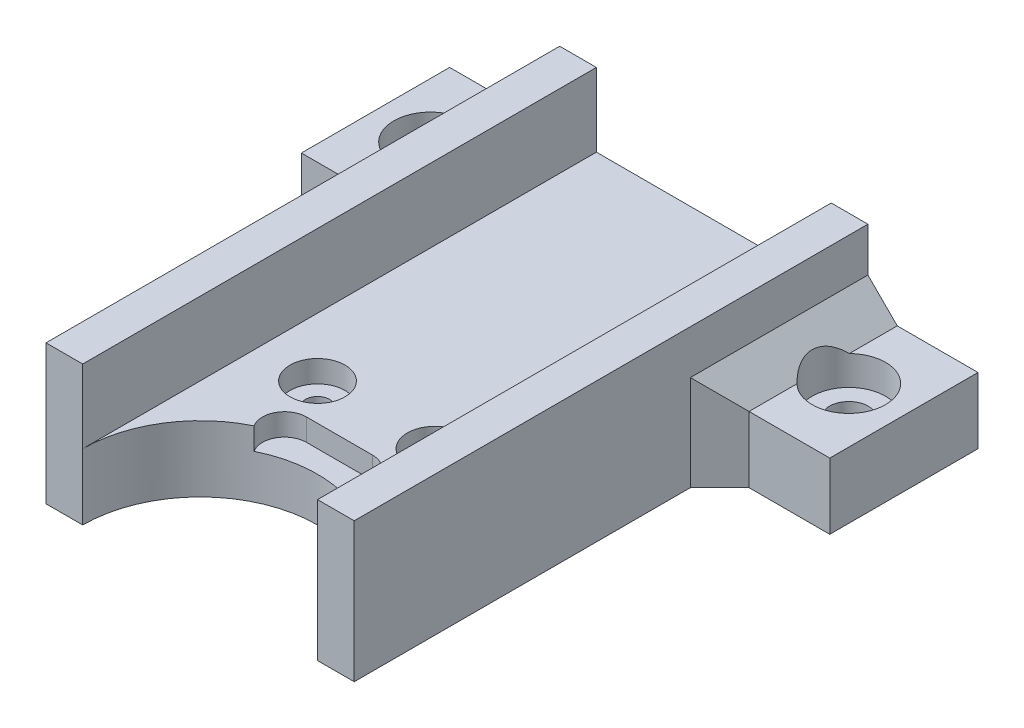
ISO-10303-21;
HEADER;
FILE_DESCRIPTION(('STEP AP214'),'2;1');
FILE_NAME('part.step','',(''),(''),'','','');
FILE_SCHEMA(('AUTOMOTIVE_DESIGN { 1 0 10303 214 1 1 1 1 }'));
ENDSEC;
DATA;
#1=APPLICATION_CONTEXT('core data for automotive mechanical design processes');
#2=APPLICATION_PROTOCOL_DEFINITION('international standard','automotive_design',2000,#1);
#3=PRODUCT_CONTEXT('',#1,'mechanical');
#4=PRODUCT('Part','Part','',(#3));
#5=PRODUCT_RELATED_PRODUCT_CATEGORY('part','',(#4));
#6=PRODUCT_DEFINITION_FORMATION('','',#4);
#7=PRODUCT_DEFINITION_CONTEXT('part definition',#1,'design');
#8=PRODUCT_DEFINITION('design','',#6,#7);
#9=PRODUCT_DEFINITION_SHAPE('','',#8);
#10=(LENGTH_UNIT() NAMED_UNIT(*) SI_UNIT(.MILLI.,.METRE.));
#11=(NAMED_UNIT(*) PLANE_ANGLE_UNIT() SI_UNIT($,.RADIAN.));
#12=(NAMED_UNIT(*) SI_UNIT($,.STERADIAN.) SOLID_ANGLE_UNIT());
#13=UNCERTAINTY_MEASURE_WITH_UNIT(LENGTH_MEASURE(1.E-05),#10,'distance_accuracy_value','');
#14=(GEOMETRIC_REPRESENTATION_CONTEXT(3) GLOBAL_UNCERTAINTY_ASSIGNED_CONTEXT((#13)) GLOBAL_UNIT_ASSIGNED_CONTEXT((#10,
#11,#12)) REPRESENTATION_CONTEXT('',''));
#15=CARTESIAN_POINT('',(0.,0.,0.));
#16=DIRECTION('',(0.,0.,1.));
#17=DIRECTION('',(1.,0.,0.));
#18=AXIS2_PLACEMENT_3D('',#15,#16,#17);
#19=CARTESIAN_POINT('',(-7.5,9.,-59.9000000000001));
#20=DIRECTION('',(0.,-1.,0.));
#21=DIRECTION('',(0.,0.,-1.));
#22=AXIS2_PLACEMENT_3D('',#19,#20,#21);
#23=CYLINDRICAL_SURFACE('',#22,2.64999999999999);
#24=CARTESIAN_POINT('',(-7.5,0.,-59.9000000000001));
#25=DIRECTION('',(0.,1.,0.));
#26=DIRECTION('',(0.,0.,1.));
#27=AXIS2_PLACEMENT_3D('',#24,#25,#26);
#28=CIRCLE('',#27,2.64999999999999);
#29=CARTESIAN_POINT('',(-7.5,0.,-57.2500000000001));
#30=VERTEX_POINT('',#29);
#31=EDGE_CURVE('E381',#30,#30,#28,.T.);
#32=ORIENTED_EDGE('',*,*,#31,.F.);
#33=EDGE_LOOP('',(#32));
#34=FACE_BOUND('',#33,.T.);
#35=CARTESIAN_POINT('',(-7.5,5.,-59.9000000000001));
#36=DIRECTION('',(0.,1.,0.));
#37=DIRECTION('',(0.,0.,1.));
#38=AXIS2_PLACEMENT_3D('',#35,#36,#37);
#39=CIRCLE('',#38,2.64999999999999);
#40=CARTESIAN_POINT('',(-7.5,5.,-57.2500000000001));
#41=VERTEX_POINT('',#40);
#42=EDGE_CURVE('E48',#41,#41,#39,.T.);
#43=ORIENTED_EDGE('',*,*,#42,.T.);
#44=EDGE_LOOP('',(#43));
#45=FACE_BOUND('',#44,.T.);
#46=ADVANCED_FACE('F43',(#34,#45),#23,.F.);
#47=CARTESIAN_POINT('',(49.5,9.,-59.9000000000001));
#48=DIRECTION('',(0.,-1.,0.));
#49=DIRECTION('',(0.,0.,-1.));
#50=AXIS2_PLACEMENT_3D('',#47,#48,#49);
#51=CYLINDRICAL_SURFACE('',#50,2.65);
#52=CARTESIAN_POINT('',(49.5,0.,-59.9000000000001));
#53=DIRECTION('',(0.,1.,0.));
#54=DIRECTION('',(0.,0.,1.));
#55=AXIS2_PLACEMENT_3D('',#52,#53,#54);
#56=CIRCLE('',#55,2.65);
#57=CARTESIAN_POINT('',(49.5,0.,-57.2500000000001));
#58=VERTEX_POINT('',#57);
#59=EDGE_CURVE('E377',#58,#58,#56,.T.);
#60=ORIENTED_EDGE('',*,*,#59,.F.);
#61=EDGE_LOOP('',(#60));
#62=FACE_BOUND('',#61,.T.);
#63=CARTESIAN_POINT('',(49.5,5.,-59.9000000000001));
#64=DIRECTION('',(0.,1.,0.));
#65=DIRECTION('',(0.,0.,1.));
#66=AXIS2_PLACEMENT_3D('',#63,#64,#65);
#67=CIRCLE('',#66,2.65);
#68=CARTESIAN_POINT('',(49.5,5.,-57.2500000000001));
#69=VERTEX_POINT('',#68);
#70=EDGE_CURVE('E252',#69,#69,#67,.T.);
#71=ORIENTED_EDGE('',*,*,#70,.T.);
#72=EDGE_LOOP('',(#71));
#73=FACE_BOUND('',#72,.T.);
#74=ADVANCED_FACE('F597',(#62,#73),#51,.F.);
#75=CARTESIAN_POINT('',(29.,10.,-24.));
#76=DIRECTION('',(0.,-1.,0.));
#77=DIRECTION('',(0.,0.,-1.));
#78=AXIS2_PLACEMENT_3D('',#75,#76,#77);
#79=CYLINDRICAL_SURFACE('',#78,1.65);
#80=CARTESIAN_POINT('',(29.,0.,-24.));
#81=DIRECTION('',(0.,-1.,0.));
#82=DIRECTION('',(0.,0.,-1.));
#83=AXIS2_PLACEMENT_3D('',#80,#81,#82);
#84=CIRCLE('',#83,1.65);
#85=CARTESIAN_POINT('',(29.,0.,-25.65));
#86=VERTEX_POINT('',#85);
#87=EDGE_CURVE('E314',#86,#86,#84,.T.);
#88=ORIENTED_EDGE('',*,*,#87,.T.);
#89=EDGE_LOOP('',(#88));
#90=FACE_BOUND('',#89,.T.);
#91=CARTESIAN_POINT('',(29.,6.,-24.));
#92=DIRECTION('',(0.,1.,0.));
#93=DIRECTION('',(0.,0.,1.));
#94=AXIS2_PLACEMENT_3D('',#91,#92,#93);
#95=CIRCLE('',#94,1.65);
#96=CARTESIAN_POINT('',(29.,6.,-22.35));
#97=VERTEX_POINT('',#96);
#98=EDGE_CURVE('E318',#97,#97,#95,.F.);
#99=ORIENTED_EDGE('',*,*,#98,.F.);
#100=EDGE_LOOP('',(#99));
#101=FACE_BOUND('',#100,.T.);
#102=ADVANCED_FACE('F603',(#90,#101),#79,.F.);
#103=CARTESIAN_POINT('',(13.,10.,-24.));
#104=DIRECTION('',(0.,-1.,0.));
#105=DIRECTION('',(0.,0.,-1.));
#106=AXIS2_PLACEMENT_3D('',#103,#104,#105);
#107=CYLINDRICAL_SURFACE('',#106,1.65);
#108=CARTESIAN_POINT('',(13.,0.,-24.));
#109=DIRECTION('',(0.,-1.,0.));
#110=DIRECTION('',(0.,0.,-1.));
#111=AXIS2_PLACEMENT_3D('',#108,#109,#110);
#112=CIRCLE('',#111,1.65);
#113=CARTESIAN_POINT('',(13.,0.,-25.65));
#114=VERTEX_POINT('',#113);
#115=EDGE_CURVE('E309',#114,#114,#112,.T.);
#116=ORIENTED_EDGE('',*,*,#115,.T.);
#117=EDGE_LOOP('',(#116));
#118=FACE_BOUND('',#117,.T.);
#119=CARTESIAN_POINT('',(13.,6.,-24.));
#120=DIRECTION('',(0.,1.,0.));
#121=DIRECTION('',(0.,0.,1.));
#122=AXIS2_PLACEMENT_3D('',#119,#120,#121);
#123=CIRCLE('',#122,1.65);
#124=CARTESIAN_POINT('',(13.,6.,-22.35));
#125=VERTEX_POINT('',#124);
#126=EDGE_CURVE('E297',#125,#125,#123,.F.);
#127=ORIENTED_EDGE('',*,*,#126,.F.);
#128=EDGE_LOOP('',(#127));
#129=FACE_BOUND('',#128,.T.);
#130=ADVANCED_FACE('F613',(#118,#129),#107,.F.);
#131=CARTESIAN_POINT('',(21.,9.,0.));
#132=DIRECTION('',(0.,1.,0.));
#133=DIRECTION('',(0.,0.,1.));
#134=AXIS2_PLACEMENT_3D('',#131,#132,#133);
#135=PLANE('',#134);
#136=DIRECTION('',(0.,0.,1.));
#137=VECTOR('',#136,1.);
#138=CARTESIAN_POINT('',(46.,9.,0.));
#139=LINE('',#138,#137);
#140=CARTESIAN_POINT('',(46.,9.,-70.));
#141=VERTEX_POINT('',#140);
#142=CARTESIAN_POINT('',(46.,9.,-63.4707142142715));
#143=VERTEX_POINT('',#142);
#144=EDGE_CURVE('E501',#141,#143,#139,.T.);
#145=ORIENTED_EDGE('',*,*,#144,.T.);
#146=CARTESIAN_POINT('',(49.5,9.,-59.9000000000001));
#147=DIRECTION('',(0.,1.,0.));
#148=DIRECTION('',(0.,0.,1.));
#149=AXIS2_PLACEMENT_3D('',#146,#147,#148);
#150=CIRCLE('',#149,5.00000000000001);
#151=CARTESIAN_POINT('',(46.,9.,-56.3292857857286));
#152=VERTEX_POINT('',#151);
#153=EDGE_CURVE('E60',#143,#152,#150,.F.);
#154=ORIENTED_EDGE('',*,*,#153,.T.);
#155=CARTESIAN_POINT('',(46.,9.,-49.8000000000001));
#156=VERTEX_POINT('',#155);
#157=EDGE_CURVE('E500',#152,#156,#139,.T.);
#158=ORIENTED_EDGE('',*,*,#157,.T.);
#159=DIRECTION('',(1.,0.,0.));
#160=VECTOR('',#159,1.);
#161=CARTESIAN_POINT('',(57.,9.,-49.8000000000001));
#162=LINE('',#161,#160);
#163=CARTESIAN_POINT('',(57.,9.,-49.8000000000001));
#164=VERTEX_POINT('',#163);
#165=EDGE_CURVE('E403',#156,#164,#162,.T.);
#166=ORIENTED_EDGE('',*,*,#165,.T.);
#167=DIRECTION('',(0.,0.,-1.));
#168=VECTOR('',#167,1.);
#169=CARTESIAN_POINT('',(57.,9.,-70.));
#170=LINE('',#169,#168);
#171=CARTESIAN_POINT('',(57.,9.,-70.));
#172=VERTEX_POINT('',#171);
#173=EDGE_CURVE('E406',#164,#172,#170,.T.);
#174=ORIENTED_EDGE('',*,*,#173,.T.);
#175=DIRECTION('',(-1.,0.,0.));
#176=VECTOR('',#175,1.);
#177=CARTESIAN_POINT('',(0.,9.,-70.));
#178=LINE('',#177,#176);
#179=EDGE_CURVE('E386',#172,#141,#178,.T.);
#180=ORIENTED_EDGE('',*,*,#179,.T.);
#181=EDGE_LOOP('',(#145,#154,#158,#166,#174,#180));
#182=FACE_BOUND('',#181,.T.);
#183=ADVANCED_FACE('F566',(#182),#135,.T.);
#184=CARTESIAN_POINT('',(16.5,9.,-16.));
#185=DIRECTION('',(0.,1.,0.));
#186=DIRECTION('',(0.,0.,1.));
#187=AXIS2_PLACEMENT_3D('',#184,#185,#186);
#188=CIRCLE('',#187,3.);
#189=CARTESIAN_POINT('',(16.5,9.,-19.));
#190=VERTEX_POINT('',#189);
#191=CARTESIAN_POINT('',(13.9773001549495,9.,-14.3764281685795));
#192=VERTEX_POINT('',#191);
#193=EDGE_CURVE('E248',#190,#192,#188,.T.);
#194=ORIENTED_EDGE('',*,*,#193,.F.);
#195=DIRECTION('',(-1.,0.,0.));
#196=VECTOR('',#195,1.);
#197=CARTESIAN_POINT('',(16.5,9.,-19.));
#198=LINE('',#197,#196);
#199=CARTESIAN_POINT('',(25.5,9.,-19.));
#200=VERTEX_POINT('',#199);
#201=EDGE_CURVE('E270',#200,#190,#198,.T.);
#202=ORIENTED_EDGE('',*,*,#201,.F.);
#203=CARTESIAN_POINT('',(25.5,9.,-16.));
#204=DIRECTION('',(0.,1.,0.));
#205=DIRECTION('',(0.,0.,1.));
#206=AXIS2_PLACEMENT_3D('',#203,#204,#205);
#207=CIRCLE('',#206,3.);
#208=CARTESIAN_POINT('',(28.0226998450505,9.,-14.3764281685795));
#209=VERTEX_POINT('',#208);
#210=EDGE_CURVE('E280',#209,#200,#207,.T.);
#211=ORIENTED_EDGE('',*,*,#210,.F.);
#212=CARTESIAN_POINT('',(21.,9.,0.));
#213=DIRECTION('',(0.,-1.,0.));
#214=DIRECTION('',(0.,0.,1.));
#215=AXIS2_PLACEMENT_3D('',#212,#213,#214);
#216=CIRCLE('',#215,16.);
#217=CARTESIAN_POINT('',(37.,9.,0.));
#218=VERTEX_POINT('',#217);
#219=EDGE_CURVE('E398',#209,#218,#216,.T.);
#220=ORIENTED_EDGE('',*,*,#219,.T.);
#221=DIRECTION('',(0.,0.,1.));
#222=VECTOR('',#221,1.);
#223=CARTESIAN_POINT('',(37.,9.,0.));
#224=LINE('',#223,#222);
#225=CARTESIAN_POINT('',(37.,9.,-70.));
#226=VERTEX_POINT('',#225);
#227=EDGE_CURVE('E313',#226,#218,#224,.T.);
#228=ORIENTED_EDGE('',*,*,#227,.F.);
#229=CARTESIAN_POINT('',(5.,9.,-70.));
#230=VERTEX_POINT('',#229);
#231=EDGE_CURVE('E391',#226,#230,#178,.T.);
#232=ORIENTED_EDGE('',*,*,#231,.T.);
#233=DIRECTION('',(0.,0.,-1.));
#234=VECTOR('',#233,1.);
#235=CARTESIAN_POINT('',(5.,9.,0.));
#236=LINE('',#235,#234);
#237=CARTESIAN_POINT('',(4.99999999999999,9.,0.));
#238=VERTEX_POINT('',#237);
#239=EDGE_CURVE('E348',#238,#230,#236,.T.);
#240=ORIENTED_EDGE('',*,*,#239,.F.);
#241=EDGE_CURVE('E399',#238,#192,#216,.T.);
#242=ORIENTED_EDGE('',*,*,#241,.T.);
#243=EDGE_LOOP('',(#194,#202,#211,#220,#228,#232,#240,#242));
#244=FACE_BOUND('',#243,.T.);
#245=CARTESIAN_POINT('',(13.,9.,-24.));
#246=DIRECTION('',(0.,1.,0.));
#247=DIRECTION('',(0.,0.,1.));
#248=AXIS2_PLACEMENT_3D('',#245,#246,#247);
#249=CIRCLE('',#248,3.75);
#250=CARTESIAN_POINT('',(13.,9.,-20.25));
#251=VERTEX_POINT('',#250);
#252=EDGE_CURVE('E298',#251,#251,#249,.T.);
#253=ORIENTED_EDGE('',*,*,#252,.F.);
#254=EDGE_LOOP('',(#253));
#255=FACE_BOUND('',#254,.T.);
#256=CARTESIAN_POINT('',(29.,9.,-24.));
#257=DIRECTION('',(0.,1.,0.));
#258=DIRECTION('',(0.,0.,1.));
#259=AXIS2_PLACEMENT_3D('',#256,#257,#258);
#260=CIRCLE('',#259,3.75);
#261=CARTESIAN_POINT('',(29.,9.,-20.25));
#262=VERTEX_POINT('',#261);
#263=EDGE_CURVE('E289',#262,#262,#260,.T.);
#264=ORIENTED_EDGE('',*,*,#263,.F.);
#265=EDGE_LOOP('',(#264));
#266=FACE_BOUND('',#265,.T.);
#267=ADVANCED_FACE('F612',(#244,#255,#266),#135,.T.);
#268=DIRECTION('',(0.,0.,-1.));
#269=VECTOR('',#268,1.);
#270=CARTESIAN_POINT('',(-3.99999999999999,9.,0.));
#271=LINE('',#270,#269);
#272=CARTESIAN_POINT('',(-3.99999999999999,9.,-49.8000000000001));
#273=VERTEX_POINT('',#272);
#274=CARTESIAN_POINT('',(-3.99999999999999,9.,-56.3292857857286));
#275=VERTEX_POINT('',#274);
#276=EDGE_CURVE('E218',#273,#275,#271,.T.);
#277=ORIENTED_EDGE('',*,*,#276,.T.);
#278=CARTESIAN_POINT('',(-7.5,9.,-59.9000000000001));
#279=DIRECTION('',(0.,1.,0.));
#280=DIRECTION('',(0.,0.,1.));
#281=AXIS2_PLACEMENT_3D('',#278,#279,#280);
#282=CIRCLE('',#281,5.00000000000001);
#283=CARTESIAN_POINT('',(-3.99999999999999,9.,-63.4707142142715));
#284=VERTEX_POINT('',#283);
#285=EDGE_CURVE('E67',#275,#284,#282,.F.);
#286=ORIENTED_EDGE('',*,*,#285,.T.);
#287=CARTESIAN_POINT('',(-3.99999999999999,9.,-70.));
#288=VERTEX_POINT('',#287);
#289=EDGE_CURVE('E215',#284,#288,#271,.T.);
#290=ORIENTED_EDGE('',*,*,#289,.T.);
#291=CARTESIAN_POINT('',(-15.,9.,-70.));
#292=VERTEX_POINT('',#291);
#293=EDGE_CURVE('E392',#288,#292,#178,.T.);
#294=ORIENTED_EDGE('',*,*,#293,.T.);
#295=DIRECTION('',(0.,0.,1.));
#296=VECTOR('',#295,1.);
#297=CARTESIAN_POINT('',(-15.,9.,-70.));
#298=LINE('',#297,#296);
#299=CARTESIAN_POINT('',(-15.,9.,-49.8000000000001));
#300=VERTEX_POINT('',#299);
#301=EDGE_CURVE('E390',#292,#300,#298,.T.);
#302=ORIENTED_EDGE('',*,*,#301,.T.);
#303=DIRECTION('',(1.,0.,0.));
#304=VECTOR('',#303,1.);
#305=CARTESIAN_POINT('',(0.,9.,-49.8000000000001));
#306=LINE('',#305,#304);
#307=EDGE_CURVE('E395',#300,#273,#306,.T.);
#308=ORIENTED_EDGE('',*,*,#307,.T.);
#309=EDGE_LOOP('',(#277,#286,#290,#294,#302,#308));
#310=FACE_BOUND('',#309,.T.);
#311=ADVANCED_FACE('F214',(#310),#135,.T.);
#312=CARTESIAN_POINT('',(21.,0.,0.));
#313=DIRECTION('',(0.,1.,0.));
#314=DIRECTION('',(0.,0.,1.));
#315=AXIS2_PLACEMENT_3D('',#312,#313,#314);
#316=PLANE('',#315);
#317=ORIENTED_EDGE('',*,*,#115,.F.);
#318=EDGE_LOOP('',(#317));
#319=FACE_BOUND('',#318,.T.);
#320=ORIENTED_EDGE('',*,*,#87,.F.);
#321=EDGE_LOOP('',(#320));
#322=FACE_BOUND('',#321,.T.);
#323=DIRECTION('',(-1.,0.,0.));
#324=VECTOR('',#323,1.);
#325=CARTESIAN_POINT('',(0.,0.,-70.));
#326=LINE('',#325,#324);
#327=CARTESIAN_POINT('',(57.,0.,-70.));
#328=VERTEX_POINT('',#327);
#329=CARTESIAN_POINT('',(-15.,0.,-70.));
#330=VERTEX_POINT('',#329);
#331=EDGE_CURVE('E385',#328,#330,#326,.T.);
#332=ORIENTED_EDGE('',*,*,#331,.F.);
#333=DIRECTION('',(0.,0.,-1.));
#334=VECTOR('',#333,1.);
#335=CARTESIAN_POINT('',(57.,0.,-70.));
#336=LINE('',#335,#334);
#337=CARTESIAN_POINT('',(57.,0.,-49.8000000000001));
#338=VERTEX_POINT('',#337);
#339=EDGE_CURVE('E438',#338,#328,#336,.T.);
#340=ORIENTED_EDGE('',*,*,#339,.F.);
#341=DIRECTION('',(1.,0.,0.));
#342=VECTOR('',#341,1.);
#343=CARTESIAN_POINT('',(57.,0.,-49.8000000000001));
#344=LINE('',#343,#342);
#345=CARTESIAN_POINT('',(46.,0.,-49.8000000000001));
#346=VERTEX_POINT('',#345);
#347=EDGE_CURVE('E435',#346,#338,#344,.T.);
#348=ORIENTED_EDGE('',*,*,#347,.F.);
#349=DIRECTION('',(0.707106781186544,0.,-0.707106781186551));
#350=VECTOR('',#349,1.);
#351=CARTESIAN_POINT('',(8.60000000000006,0.,-12.3999999999998));
#352=LINE('',#351,#350);
#353=CARTESIAN_POINT('',(42.,0.,-45.8000000000001));
#354=VERTEX_POINT('',#353);
#355=EDGE_CURVE('E229',#346,#354,#352,.F.);
#356=ORIENTED_EDGE('',*,*,#355,.T.);
#357=DIRECTION('',(0.,0.,-1.));
#358=VECTOR('',#357,1.);
#359=CARTESIAN_POINT('',(42.,0.,-49.8000000000001));
#360=LINE('',#359,#358);
#361=CARTESIAN_POINT('',(42.,0.,0.));
#362=VERTEX_POINT('',#361);
#363=EDGE_CURVE('E431',#362,#354,#360,.T.);
#364=ORIENTED_EDGE('',*,*,#363,.F.);
#365=DIRECTION('',(1.,0.,0.));
#366=VECTOR('',#365,1.);
#367=CARTESIAN_POINT('',(42.,0.,0.));
#368=LINE('',#367,#366);
#369=CARTESIAN_POINT('',(37.,0.,0.));
#370=VERTEX_POINT('',#369);
#371=EDGE_CURVE('E428',#370,#362,#368,.T.);
#372=ORIENTED_EDGE('',*,*,#371,.F.);
#373=CARTESIAN_POINT('',(21.,0.,0.));
#374=DIRECTION('',(0.,-1.,0.));
#375=DIRECTION('',(0.,0.,1.));
#376=AXIS2_PLACEMENT_3D('',#373,#374,#375);
#377=CIRCLE('',#376,16.);
#378=CARTESIAN_POINT('',(4.99999999999999,0.,0.));
#379=VERTEX_POINT('',#378);
#380=EDGE_CURVE('E425',#379,#370,#377,.T.);
#381=ORIENTED_EDGE('',*,*,#380,.F.);
#382=DIRECTION('',(1.,0.,0.));
#383=VECTOR('',#382,1.);
#384=CARTESIAN_POINT('',(4.99999999999999,0.,0.));
#385=LINE('',#384,#383);
#386=CARTESIAN_POINT('',(0.,0.,0.));
#387=VERTEX_POINT('',#386);
#388=EDGE_CURVE('E422',#387,#379,#385,.T.);
#389=ORIENTED_EDGE('',*,*,#388,.F.);
#390=DIRECTION('',(0.,0.,1.));
#391=VECTOR('',#390,1.);
#392=CARTESIAN_POINT('',(0.,0.,0.));
#393=LINE('',#392,#391);
#394=CARTESIAN_POINT('',(0.,0.,-45.8000000000001));
#395=VERTEX_POINT('',#394);
#396=EDGE_CURVE('E419',#395,#387,#393,.T.);
#397=ORIENTED_EDGE('',*,*,#396,.F.);
#398=DIRECTION('',(0.707106781186544,0.,0.707106781186551));
#399=VECTOR('',#398,1.);
#400=CARTESIAN_POINT('',(33.3999999999999,0.,-12.3999999999998));
#401=LINE('',#400,#399);
#402=CARTESIAN_POINT('',(-3.99999999999999,0.,-49.8000000000001));
#403=VERTEX_POINT('',#402);
#404=EDGE_CURVE('E239',#395,#403,#401,.F.);
#405=ORIENTED_EDGE('',*,*,#404,.T.);
#406=DIRECTION('',(1.,0.,0.));
#407=VECTOR('',#406,1.);
#408=CARTESIAN_POINT('',(0.,0.,-49.8000000000001));
#409=LINE('',#408,#407);
#410=CARTESIAN_POINT('',(-15.,0.,-49.8000000000001));
#411=VERTEX_POINT('',#410);
#412=EDGE_CURVE('E415',#411,#403,#409,.T.);
#413=ORIENTED_EDGE('',*,*,#412,.F.);
#414=DIRECTION('',(0.,0.,1.));
#415=VECTOR('',#414,1.);
#416=CARTESIAN_POINT('',(-15.,0.,-70.));
#417=LINE('',#416,#415);
#418=EDGE_CURVE('E412',#330,#411,#417,.T.);
#419=ORIENTED_EDGE('',*,*,#418,.F.);
#420=EDGE_LOOP('',(#332,#340,#348,#356,#364,#372,#381,#389,#397,#405,#413,#419));
#421=FACE_BOUND('',#420,.T.);
#422=ORIENTED_EDGE('',*,*,#31,.T.);
#423=EDGE_LOOP('',(#422));
#424=FACE_BOUND('',#423,.T.);
#425=ORIENTED_EDGE('',*,*,#59,.T.);
#426=EDGE_LOOP('',(#425));
#427=FACE_BOUND('',#426,.T.);
#428=ADVANCED_FACE('F516',(#319,#322,#421,#424,#427),#316,.F.);
#429=CARTESIAN_POINT('',(0.,9.,-70.));
#430=DIRECTION('',(0.,0.,1.));
#431=DIRECTION('',(1.,0.,0.));
#432=AXIS2_PLACEMENT_3D('',#429,#430,#431);
#433=PLANE('',#432);
#434=ORIENTED_EDGE('',*,*,#331,.T.);
#435=DIRECTION('',(0.,-1.,0.));
#436=VECTOR('',#435,1.);
#437=CARTESIAN_POINT('',(-15.,9.,-70.));
#438=LINE('',#437,#436);
#439=EDGE_CURVE('E469',#292,#330,#438,.T.);
#440=ORIENTED_EDGE('',*,*,#439,.F.);
#441=ORIENTED_EDGE('',*,*,#293,.F.);
#442=DIRECTION('',(0.707106781186544,0.707106781186551,0.));
#443=VECTOR('',#442,1.);
#444=CARTESIAN_POINT('',(-2.00000000000002,11.,-70.));
#445=LINE('',#444,#443);
#446=CARTESIAN_POINT('',(0.,13.,-70.));
#447=VERTEX_POINT('',#446);
#448=EDGE_CURVE('E211',#288,#447,#445,.T.);
#449=ORIENTED_EDGE('',*,*,#448,.T.);
#450=DIRECTION('',(0.,-1.,0.));
#451=VECTOR('',#450,1.);
#452=CARTESIAN_POINT('',(0.,19.,-70.));
#453=LINE('',#452,#451);
#454=CARTESIAN_POINT('',(0.,19.,-70.));
#455=VERTEX_POINT('',#454);
#456=EDGE_CURVE('E362',#455,#447,#453,.T.);
#457=ORIENTED_EDGE('',*,*,#456,.F.);
#458=DIRECTION('',(-1.,0.,0.));
#459=VECTOR('',#458,1.);
#460=CARTESIAN_POINT('',(0.,19.,-70.));
#461=LINE('',#460,#459);
#462=CARTESIAN_POINT('',(5.,19.,-70.));
#463=VERTEX_POINT('',#462);
#464=EDGE_CURVE('E359',#463,#455,#461,.T.);
#465=ORIENTED_EDGE('',*,*,#464,.F.);
#466=DIRECTION('',(0.,-1.,0.));
#467=VECTOR('',#466,1.);
#468=CARTESIAN_POINT('',(5.,19.,-70.));
#469=LINE('',#468,#467);
#470=EDGE_CURVE('E369',#463,#230,#469,.T.);
#471=ORIENTED_EDGE('',*,*,#470,.T.);
#472=ORIENTED_EDGE('',*,*,#231,.F.);
#473=DIRECTION('',(0.,-1.,0.));
#474=VECTOR('',#473,1.);
#475=CARTESIAN_POINT('',(37.,19.,-70.));
#476=LINE('',#475,#474);
#477=CARTESIAN_POINT('',(37.,19.,-70.));
#478=VERTEX_POINT('',#477);
#479=EDGE_CURVE('E340',#478,#226,#476,.T.);
#480=ORIENTED_EDGE('',*,*,#479,.F.);
#481=DIRECTION('',(-1.,0.,0.));
#482=VECTOR('',#481,1.);
#483=CARTESIAN_POINT('',(42.,19.,-70.));
#484=LINE('',#483,#482);
#485=CARTESIAN_POINT('',(42.,19.,-70.));
#486=VERTEX_POINT('',#485);
#487=EDGE_CURVE('E323',#486,#478,#484,.T.);
#488=ORIENTED_EDGE('',*,*,#487,.F.);
#489=DIRECTION('',(0.,-1.,0.));
#490=VECTOR('',#489,1.);
#491=CARTESIAN_POINT('',(42.,19.,-70.));
#492=LINE('',#491,#490);
#493=CARTESIAN_POINT('',(42.,13.,-70.));
#494=VERTEX_POINT('',#493);
#495=EDGE_CURVE('E344',#486,#494,#492,.T.);
#496=ORIENTED_EDGE('',*,*,#495,.T.);
#497=DIRECTION('',(0.707106781186544,-0.707106781186551,0.));
#498=VECTOR('',#497,1.);
#499=CARTESIAN_POINT('',(23.0000000000002,32.,-70.));
#500=LINE('',#499,#498);
#501=EDGE_CURVE('E236',#494,#141,#500,.T.);
#502=ORIENTED_EDGE('',*,*,#501,.T.);
#503=ORIENTED_EDGE('',*,*,#179,.F.);
#504=DIRECTION('',(0.,-1.,0.));
#505=VECTOR('',#504,1.);
#506=CARTESIAN_POINT('',(57.,9.,-70.));
#507=LINE('',#506,#505);
#508=EDGE_CURVE('E409',#172,#328,#507,.T.);
#509=ORIENTED_EDGE('',*,*,#508,.T.);
#510=EDGE_LOOP('',(#434,#440,#441,#449,#457,#465,#471,#472,#480,#488,#496,#502,#503,#509));
#511=FACE_BOUND('',#510,.T.);
#512=ADVANCED_FACE('F563',(#511),#433,.F.);
#513=CARTESIAN_POINT('',(-15.,9.,-70.));
#514=DIRECTION('',(1.,0.,0.));
#515=DIRECTION('',(0.,0.,-1.));
#516=AXIS2_PLACEMENT_3D('',#513,#514,#515);
#517=PLANE('',#516);
#518=ORIENTED_EDGE('',*,*,#418,.T.);
#519=DIRECTION('',(0.,-1.,0.));
#520=VECTOR('',#519,1.);
#521=CARTESIAN_POINT('',(-15.,9.,-49.8000000000001));
#522=LINE('',#521,#520);
#523=EDGE_CURVE('E465',#300,#411,#522,.T.);
#524=ORIENTED_EDGE('',*,*,#523,.F.);
#525=ORIENTED_EDGE('',*,*,#301,.F.);
#526=ORIENTED_EDGE('',*,*,#439,.T.);
#527=EDGE_LOOP('',(#518,#524,#525,#526));
#528=FACE_BOUND('',#527,.T.);
#529=ADVANCED_FACE('F553',(#528),#517,.F.);
#530=CARTESIAN_POINT('',(0.,9.,-49.8000000000001));
#531=DIRECTION('',(0.,0.,-1.));
#532=DIRECTION('',(-1.,0.,0.));
#533=AXIS2_PLACEMENT_3D('',#530,#531,#532);
#534=PLANE('',#533);
#535=ORIENTED_EDGE('',*,*,#412,.T.);
#536=DIRECTION('',(0.,1.,0.));
#537=VECTOR('',#536,1.);
#538=CARTESIAN_POINT('',(-3.99999999999999,9.,-49.8000000000001));
#539=LINE('',#538,#537);
#540=EDGE_CURVE('E225',#403,#273,#539,.T.);
#541=ORIENTED_EDGE('',*,*,#540,.T.);
#542=ORIENTED_EDGE('',*,*,#307,.F.);
#543=ORIENTED_EDGE('',*,*,#523,.T.);
#544=EDGE_LOOP('',(#535,#541,#542,#543));
#545=FACE_BOUND('',#544,.T.);
#546=ADVANCED_FACE('F548',(#545),#534,.F.);
#547=CARTESIAN_POINT('',(0.,9.,0.));
#548=DIRECTION('',(1.,0.,0.));
#549=DIRECTION('',(0.,0.,-1.));
#550=AXIS2_PLACEMENT_3D('',#547,#548,#549);
#551=PLANE('',#550);
#552=DIRECTION('',(0.,0.,1.));
#553=VECTOR('',#552,1.);
#554=CARTESIAN_POINT('',(0.,13.,0.));
#555=LINE('',#554,#553);
#556=CARTESIAN_POINT('',(0.,13.,-45.8000000000001));
#557=VERTEX_POINT('',#556);
#558=EDGE_CURVE('E504',#447,#557,#555,.T.);
#559=ORIENTED_EDGE('',*,*,#558,.T.);
#560=DIRECTION('',(0.,-1.,0.));
#561=VECTOR('',#560,1.);
#562=CARTESIAN_POINT('',(0.,0.,-45.8000000000001));
#563=LINE('',#562,#561);
#564=EDGE_CURVE('E230',#557,#395,#563,.T.);
#565=ORIENTED_EDGE('',*,*,#564,.T.);
#566=ORIENTED_EDGE('',*,*,#396,.T.);
#567=DIRECTION('',(0.,-1.,0.));
#568=VECTOR('',#567,1.);
#569=CARTESIAN_POINT('',(0.,9.,0.));
#570=LINE('',#569,#568);
#571=CARTESIAN_POINT('',(0.,19.,0.));
#572=VERTEX_POINT('',#571);
#573=EDGE_CURVE('E461',#572,#387,#570,.T.);
#574=ORIENTED_EDGE('',*,*,#573,.F.);
#575=DIRECTION('',(0.,0.,1.));
#576=VECTOR('',#575,1.);
#577=CARTESIAN_POINT('',(0.,19.,0.));
#578=LINE('',#577,#576);
#579=EDGE_CURVE('E349',#455,#572,#578,.T.);
#580=ORIENTED_EDGE('',*,*,#579,.F.);
#581=ORIENTED_EDGE('',*,*,#456,.T.);
#582=EDGE_LOOP('',(#559,#565,#566,#574,#580,#581));
#583=FACE_BOUND('',#582,.T.);
#584=ADVANCED_FACE('F511',(#583),#551,.F.);
#585=CARTESIAN_POINT('',(4.99999999999999,9.,0.));
#586=DIRECTION('',(0.,0.,-1.));
#587=DIRECTION('',(-1.,0.,0.));
#588=AXIS2_PLACEMENT_3D('',#585,#586,#587);
#589=PLANE('',#588);
#590=ORIENTED_EDGE('',*,*,#388,.T.);
#591=DIRECTION('',(0.,-1.,0.));
#592=VECTOR('',#591,1.);
#593=CARTESIAN_POINT('',(4.99999999999999,9.,0.));
#594=LINE('',#593,#592);
#595=EDGE_CURVE('E457',#238,#379,#594,.T.);
#596=ORIENTED_EDGE('',*,*,#595,.F.);
#597=DIRECTION('',(0.,-1.,0.));
#598=VECTOR('',#597,1.);
#599=CARTESIAN_POINT('',(5.,19.,0.));
#600=LINE('',#599,#598);
#601=CARTESIAN_POINT('',(5.,19.,0.));
#602=VERTEX_POINT('',#601);
#603=EDGE_CURVE('E373',#602,#238,#600,.T.);
#604=ORIENTED_EDGE('',*,*,#603,.F.);
#605=DIRECTION('',(1.,0.,0.));
#606=VECTOR('',#605,1.);
#607=CARTESIAN_POINT('',(0.,19.,0.));
#608=LINE('',#607,#606);
#609=EDGE_CURVE('E353',#572,#602,#608,.T.);
#610=ORIENTED_EDGE('',*,*,#609,.F.);
#611=ORIENTED_EDGE('',*,*,#573,.T.);
#612=EDGE_LOOP('',(#590,#596,#604,#610,#611));
#613=FACE_BOUND('',#612,.T.);
#614=ADVANCED_FACE('F523',(#613),#589,.F.);
#615=CARTESIAN_POINT('',(21.,9.,0.));
#616=DIRECTION('',(0.,-1.,0.));
#617=DIRECTION('',(0.,0.,-1.));
#618=AXIS2_PLACEMENT_3D('',#615,#616,#617);
#619=CYLINDRICAL_SURFACE('',#618,16.);
#620=CARTESIAN_POINT('',(21.,6.,0.));
#621=DIRECTION('',(0.,1.,0.));
#622=DIRECTION('',(0.,0.,1.));
#623=AXIS2_PLACEMENT_3D('',#620,#621,#622);
#624=CIRCLE('',#623,16.);
#625=CARTESIAN_POINT('',(13.9773001549495,6.,-14.3764281685795));
#626=VERTEX_POINT('',#625);
#627=CARTESIAN_POINT('',(28.0226998450505,6.,-14.3764281685795));
#628=VERTEX_POINT('',#627);
#629=EDGE_CURVE('E473',#626,#628,#624,.F.);
#630=ORIENTED_EDGE('',*,*,#629,.F.);
#631=DIRECTION('',(0.,1.,0.));
#632=VECTOR('',#631,1.);
#633=CARTESIAN_POINT('',(13.9773001549495,7.5,-14.3764281685795));
#634=LINE('',#633,#632);
#635=EDGE_CURVE('E486',#626,#192,#634,.T.);
#636=ORIENTED_EDGE('',*,*,#635,.T.);
#637=ORIENTED_EDGE('',*,*,#241,.F.);
#638=ORIENTED_EDGE('',*,*,#595,.T.);
#639=ORIENTED_EDGE('',*,*,#380,.T.);
#640=DIRECTION('',(0.,-1.,0.));
#641=VECTOR('',#640,1.);
#642=CARTESIAN_POINT('',(37.,9.,0.));
#643=LINE('',#642,#641);
#644=EDGE_CURVE('E453',#218,#370,#643,.T.);
#645=ORIENTED_EDGE('',*,*,#644,.F.);
#646=ORIENTED_EDGE('',*,*,#219,.F.);
#647=DIRECTION('',(0.,1.,0.));
#648=VECTOR('',#647,1.);
#649=CARTESIAN_POINT('',(28.0226998450505,7.5,-14.3764281685795));
#650=LINE('',#649,#648);
#651=EDGE_CURVE('E482',#209,#628,#650,.F.);
#652=ORIENTED_EDGE('',*,*,#651,.T.);
#653=EDGE_LOOP('',(#630,#636,#637,#638,#639,#645,#646,#652));
#654=FACE_BOUND('',#653,.T.);
#655=ADVANCED_FACE('F529',(#654),#619,.F.);
#656=CARTESIAN_POINT('',(42.,9.,0.));
#657=DIRECTION('',(0.,0.,-1.));
#658=DIRECTION('',(-1.,0.,0.));
#659=AXIS2_PLACEMENT_3D('',#656,#657,#658);
#660=PLANE('',#659);
#661=ORIENTED_EDGE('',*,*,#371,.T.);
#662=DIRECTION('',(0.,-1.,0.));
#663=VECTOR('',#662,1.);
#664=CARTESIAN_POINT('',(42.,9.,0.));
#665=LINE('',#664,#663);
#666=CARTESIAN_POINT('',(42.,19.,0.));
#667=VERTEX_POINT('',#666);
#668=EDGE_CURVE('E449',#667,#362,#665,.T.);
#669=ORIENTED_EDGE('',*,*,#668,.F.);
#670=DIRECTION('',(1.,0.,0.));
#671=VECTOR('',#670,1.);
#672=CARTESIAN_POINT('',(42.,19.,0.));
#673=LINE('',#672,#671);
#674=CARTESIAN_POINT('',(37.,19.,0.));
#675=VERTEX_POINT('',#674);
#676=EDGE_CURVE('E329',#675,#667,#673,.T.);
#677=ORIENTED_EDGE('',*,*,#676,.F.);
#678=DIRECTION('',(0.,-1.,0.));
#679=VECTOR('',#678,1.);
#680=CARTESIAN_POINT('',(37.,19.,0.));
#681=LINE('',#680,#679);
#682=EDGE_CURVE('E333',#675,#218,#681,.T.);
#683=ORIENTED_EDGE('',*,*,#682,.T.);
#684=ORIENTED_EDGE('',*,*,#644,.T.);
#685=EDGE_LOOP('',(#661,#669,#677,#683,#684));
#686=FACE_BOUND('',#685,.T.);
#687=ADVANCED_FACE('F626',(#686),#660,.F.);
#688=CARTESIAN_POINT('',(42.,9.,-49.8000000000001));
#689=DIRECTION('',(-1.,0.,0.));
#690=DIRECTION('',(0.,0.,1.));
#691=AXIS2_PLACEMENT_3D('',#688,#689,#690);
#692=PLANE('',#691);
#693=ORIENTED_EDGE('',*,*,#363,.T.);
#694=DIRECTION('',(0.,1.,0.));
#695=VECTOR('',#694,1.);
#696=CARTESIAN_POINT('',(42.,9.,-45.8000000000001));
#697=LINE('',#696,#695);
#698=CARTESIAN_POINT('',(42.,13.,-45.8000000000001));
#699=VERTEX_POINT('',#698);
#700=EDGE_CURVE('E497',#354,#699,#697,.T.);
#701=ORIENTED_EDGE('',*,*,#700,.T.);
#702=DIRECTION('',(0.,0.,-1.));
#703=VECTOR('',#702,1.);
#704=CARTESIAN_POINT('',(42.,13.,-49.8000000000001));
#705=LINE('',#704,#703);
#706=EDGE_CURVE('E494',#699,#494,#705,.T.);
#707=ORIENTED_EDGE('',*,*,#706,.T.);
#708=ORIENTED_EDGE('',*,*,#495,.F.);
#709=DIRECTION('',(0.,0.,-1.));
#710=VECTOR('',#709,1.);
#711=CARTESIAN_POINT('',(42.,19.,0.));
#712=LINE('',#711,#710);
#713=EDGE_CURVE('E319',#667,#486,#712,.T.);
#714=ORIENTED_EDGE('',*,*,#713,.F.);
#715=ORIENTED_EDGE('',*,*,#668,.T.);
#716=EDGE_LOOP('',(#693,#701,#707,#708,#714,#715));
#717=FACE_BOUND('',#716,.T.);
#718=ADVANCED_FACE('F622',(#717),#692,.F.);
#719=CARTESIAN_POINT('',(57.,9.,-49.8000000000001));
#720=DIRECTION('',(0.,0.,-1.));
#721=DIRECTION('',(-1.,0.,0.));
#722=AXIS2_PLACEMENT_3D('',#719,#720,#721);
#723=PLANE('',#722);
#724=ORIENTED_EDGE('',*,*,#165,.F.);
#725=DIRECTION('',(0.,-1.,0.));
#726=VECTOR('',#725,1.);
#727=CARTESIAN_POINT('',(46.,0.,-49.8000000000001));
#728=LINE('',#727,#726);
#729=EDGE_CURVE('E490',#156,#346,#728,.T.);
#730=ORIENTED_EDGE('',*,*,#729,.T.);
#731=ORIENTED_EDGE('',*,*,#347,.T.);
#732=DIRECTION('',(0.,-1.,0.));
#733=VECTOR('',#732,1.);
#734=CARTESIAN_POINT('',(57.,9.,-49.8000000000001));
#735=LINE('',#734,#733);
#736=EDGE_CURVE('E445',#164,#338,#735,.T.);
#737=ORIENTED_EDGE('',*,*,#736,.F.);
#738=EDGE_LOOP('',(#724,#730,#731,#737));
#739=FACE_BOUND('',#738,.T.);
#740=ADVANCED_FACE('F619',(#739),#723,.F.);
#741=CARTESIAN_POINT('',(57.,9.,-70.));
#742=DIRECTION('',(-1.,0.,0.));
#743=DIRECTION('',(0.,0.,1.));
#744=AXIS2_PLACEMENT_3D('',#741,#742,#743);
#745=PLANE('',#744);
#746=ORIENTED_EDGE('',*,*,#339,.T.);
#747=ORIENTED_EDGE('',*,*,#508,.F.);
#748=ORIENTED_EDGE('',*,*,#173,.F.);
#749=ORIENTED_EDGE('',*,*,#736,.T.);
#750=EDGE_LOOP('',(#746,#747,#748,#749));
#751=FACE_BOUND('',#750,.T.);
#752=ADVANCED_FACE('F559',(#751),#745,.F.);
#753=CARTESIAN_POINT('',(5.,19.,0.));
#754=DIRECTION('',(-1.,0.,0.));
#755=DIRECTION('',(0.,0.,1.));
#756=AXIS2_PLACEMENT_3D('',#753,#754,#755);
#757=PLANE('',#756);
#758=ORIENTED_EDGE('',*,*,#239,.T.);
#759=ORIENTED_EDGE('',*,*,#470,.F.);
#760=DIRECTION('',(0.,0.,-1.));
#761=VECTOR('',#760,1.);
#762=CARTESIAN_POINT('',(5.,19.,0.));
#763=LINE('',#762,#761);
#764=EDGE_CURVE('E356',#602,#463,#763,.T.);
#765=ORIENTED_EDGE('',*,*,#764,.F.);
#766=ORIENTED_EDGE('',*,*,#603,.T.);
#767=EDGE_LOOP('',(#758,#759,#765,#766));
#768=FACE_BOUND('',#767,.T.);
#769=ADVANCED_FACE('F536',(#768),#757,.F.);
#770=CARTESIAN_POINT('',(0.,19.,0.));
#771=DIRECTION('',(0.,-1.,0.));
#772=DIRECTION('',(0.,0.,-1.));
#773=AXIS2_PLACEMENT_3D('',#770,#771,#772);
#774=PLANE('',#773);
#775=ORIENTED_EDGE('',*,*,#579,.T.);
#776=ORIENTED_EDGE('',*,*,#609,.T.);
#777=ORIENTED_EDGE('',*,*,#764,.T.);
#778=ORIENTED_EDGE('',*,*,#464,.T.);
#779=EDGE_LOOP('',(#775,#776,#777,#778));
#780=FACE_BOUND('',#779,.T.);
#781=ADVANCED_FACE('F540',(#780),#774,.F.);
#782=CARTESIAN_POINT('',(37.,19.,0.));
#783=DIRECTION('',(1.,0.,0.));
#784=DIRECTION('',(0.,0.,-1.));
#785=AXIS2_PLACEMENT_3D('',#782,#783,#784);
#786=PLANE('',#785);
#787=ORIENTED_EDGE('',*,*,#227,.T.);
#788=ORIENTED_EDGE('',*,*,#682,.F.);
#789=DIRECTION('',(0.,0.,1.));
#790=VECTOR('',#789,1.);
#791=CARTESIAN_POINT('',(37.,19.,0.));
#792=LINE('',#791,#790);
#793=EDGE_CURVE('E326',#478,#675,#792,.T.);
#794=ORIENTED_EDGE('',*,*,#793,.F.);
#795=ORIENTED_EDGE('',*,*,#479,.T.);
#796=EDGE_LOOP('',(#787,#788,#794,#795));
#797=FACE_BOUND('',#796,.T.);
#798=ADVANCED_FACE('F705',(#797),#786,.F.);
#799=CARTESIAN_POINT('',(0.,19.,0.));
#800=DIRECTION('',(0.,1.,0.));
#801=DIRECTION('',(0.,0.,1.));
#802=AXIS2_PLACEMENT_3D('',#799,#800,#801);
#803=PLANE('',#802);
#804=ORIENTED_EDGE('',*,*,#713,.T.);
#805=ORIENTED_EDGE('',*,*,#487,.T.);
#806=ORIENTED_EDGE('',*,*,#793,.T.);
#807=ORIENTED_EDGE('',*,*,#676,.T.);
#808=EDGE_LOOP('',(#804,#805,#806,#807));
#809=FACE_BOUND('',#808,.T.);
#810=ADVANCED_FACE('F685',(#809),#803,.T.);
#811=CARTESIAN_POINT('',(13.,6.,-24.));
#812=DIRECTION('',(0.,1.,0.));
#813=DIRECTION('',(0.,0.,1.));
#814=AXIS2_PLACEMENT_3D('',#811,#812,#813);
#815=PLANE('',#814);
#816=CARTESIAN_POINT('',(13.,6.,-24.));
#817=DIRECTION('',(0.,1.,0.));
#818=DIRECTION('',(0.,0.,1.));
#819=AXIS2_PLACEMENT_3D('',#816,#817,#818);
#820=CIRCLE('',#819,3.75);
#821=CARTESIAN_POINT('',(13.,6.,-20.25));
#822=VERTEX_POINT('',#821);
#823=EDGE_CURVE('E293',#822,#822,#820,.T.);
#824=ORIENTED_EDGE('',*,*,#823,.T.);
#825=EDGE_LOOP('',(#824));
#826=FACE_BOUND('',#825,.T.);
#827=ORIENTED_EDGE('',*,*,#126,.T.);
#828=EDGE_LOOP('',(#827));
#829=FACE_BOUND('',#828,.T.);
#830=ADVANCED_FACE('F681',(#826,#829),#815,.T.);
#831=CARTESIAN_POINT('',(13.,6.,-24.));
#832=DIRECTION('',(0.,1.,0.));
#833=DIRECTION('',(0.,0.,1.));
#834=AXIS2_PLACEMENT_3D('',#831,#832,#833);
#835=CYLINDRICAL_SURFACE('',#834,3.75);
#836=ORIENTED_EDGE('',*,*,#823,.F.);
#837=EDGE_LOOP('',(#836));
#838=FACE_BOUND('',#837,.T.);
#839=ORIENTED_EDGE('',*,*,#252,.T.);
#840=EDGE_LOOP('',(#839));
#841=FACE_BOUND('',#840,.T.);
#842=ADVANCED_FACE('F684',(#838,#841),#835,.F.);
#843=CARTESIAN_POINT('',(29.,6.,-24.));
#844=DIRECTION('',(0.,1.,0.));
#845=DIRECTION('',(0.,0.,1.));
#846=AXIS2_PLACEMENT_3D('',#843,#844,#845);
#847=PLANE('',#846);
#848=CARTESIAN_POINT('',(29.,6.,-24.));
#849=DIRECTION('',(0.,1.,0.));
#850=DIRECTION('',(0.,0.,1.));
#851=AXIS2_PLACEMENT_3D('',#848,#849,#850);
#852=CIRCLE('',#851,3.75);
#853=CARTESIAN_POINT('',(29.,6.,-20.25));
#854=VERTEX_POINT('',#853);
#855=EDGE_CURVE('E302',#854,#854,#852,.T.);
#856=ORIENTED_EDGE('',*,*,#855,.T.);
#857=EDGE_LOOP('',(#856));
#858=FACE_BOUND('',#857,.T.);
#859=ORIENTED_EDGE('',*,*,#98,.T.);
#860=EDGE_LOOP('',(#859));
#861=FACE_BOUND('',#860,.T.);
#862=ADVANCED_FACE('F689',(#858,#861),#847,.T.);
#863=CARTESIAN_POINT('',(29.,6.,-24.));
#864=DIRECTION('',(0.,1.,0.));
#865=DIRECTION('',(0.,0.,1.));
#866=AXIS2_PLACEMENT_3D('',#863,#864,#865);
#867=CYLINDRICAL_SURFACE('',#866,3.75);
#868=ORIENTED_EDGE('',*,*,#855,.F.);
#869=EDGE_LOOP('',(#868));
#870=FACE_BOUND('',#869,.T.);
#871=ORIENTED_EDGE('',*,*,#263,.T.);
#872=EDGE_LOOP('',(#871));
#873=FACE_BOUND('',#872,.T.);
#874=ADVANCED_FACE('F679',(#870,#873),#867,.F.);
#875=CARTESIAN_POINT('',(16.5,6.,-16.));
#876=DIRECTION('',(0.,1.,0.));
#877=DIRECTION('',(0.,0.,1.));
#878=AXIS2_PLACEMENT_3D('',#875,#876,#877);
#879=CYLINDRICAL_SURFACE('',#878,3.);
#880=CARTESIAN_POINT('',(16.5,6.,-16.));
#881=DIRECTION('',(0.,1.,0.));
#882=DIRECTION('',(0.,0.,1.));
#883=AXIS2_PLACEMENT_3D('',#880,#881,#882);
#884=CIRCLE('',#883,3.);
#885=CARTESIAN_POINT('',(16.5,6.,-19.));
#886=VERTEX_POINT('',#885);
#887=EDGE_CURVE('E266',#886,#626,#884,.T.);
#888=ORIENTED_EDGE('',*,*,#887,.F.);
#889=DIRECTION('',(0.,1.,0.));
#890=VECTOR('',#889,1.);
#891=CARTESIAN_POINT('',(16.5,6.,-19.));
#892=LINE('',#891,#890);
#893=EDGE_CURVE('E286',#886,#190,#892,.T.);
#894=ORIENTED_EDGE('',*,*,#893,.T.);
#895=ORIENTED_EDGE('',*,*,#193,.T.);
#896=ORIENTED_EDGE('',*,*,#635,.F.);
#897=EDGE_LOOP('',(#888,#894,#895,#896));
#898=FACE_BOUND('',#897,.T.);
#899=ADVANCED_FACE('F675',(#898),#879,.F.);
#900=CARTESIAN_POINT('',(25.5,6.,-16.));
#901=DIRECTION('',(0.,1.,0.));
#902=DIRECTION('',(0.,0.,1.));
#903=AXIS2_PLACEMENT_3D('',#900,#901,#902);
#904=CYLINDRICAL_SURFACE('',#903,3.);
#905=ORIENTED_EDGE('',*,*,#210,.T.);
#906=DIRECTION('',(0.,1.,0.));
#907=VECTOR('',#906,1.);
#908=CARTESIAN_POINT('',(25.5,6.,-19.));
#909=LINE('',#908,#907);
#910=CARTESIAN_POINT('',(25.5,6.,-19.));
#911=VERTEX_POINT('',#910);
#912=EDGE_CURVE('E277',#911,#200,#909,.T.);
#913=ORIENTED_EDGE('',*,*,#912,.F.);
#914=CARTESIAN_POINT('',(25.5,6.,-16.));
#915=DIRECTION('',(0.,1.,0.));
#916=DIRECTION('',(0.,0.,1.));
#917=AXIS2_PLACEMENT_3D('',#914,#915,#916);
#918=CIRCLE('',#917,3.);
#919=EDGE_CURVE('E269',#628,#911,#918,.T.);
#920=ORIENTED_EDGE('',*,*,#919,.F.);
#921=ORIENTED_EDGE('',*,*,#651,.F.);
#922=EDGE_LOOP('',(#905,#913,#920,#921));
#923=FACE_BOUND('',#922,.T.);
#924=ADVANCED_FACE('F669',(#923),#904,.F.);
#925=CARTESIAN_POINT('',(16.5,6.,-16.));
#926=DIRECTION('',(0.,1.,0.));
#927=DIRECTION('',(0.,0.,1.));
#928=AXIS2_PLACEMENT_3D('',#925,#926,#927);
#929=PLANE('',#928);
#930=ORIENTED_EDGE('',*,*,#629,.T.);
#931=ORIENTED_EDGE('',*,*,#919,.T.);
#932=DIRECTION('',(-1.,0.,0.));
#933=VECTOR('',#932,1.);
#934=CARTESIAN_POINT('',(16.5,6.,-19.));
#935=LINE('',#934,#933);
#936=EDGE_CURVE('E273',#911,#886,#935,.T.);
#937=ORIENTED_EDGE('',*,*,#936,.T.);
#938=ORIENTED_EDGE('',*,*,#887,.T.);
#939=EDGE_LOOP('',(#930,#931,#937,#938));
#940=FACE_BOUND('',#939,.T.);
#941=ADVANCED_FACE('F663',(#940),#929,.T.);
#942=CARTESIAN_POINT('',(16.5,6.,-19.));
#943=DIRECTION('',(0.,0.,-1.));
#944=DIRECTION('',(-1.,0.,0.));
#945=AXIS2_PLACEMENT_3D('',#942,#943,#944);
#946=PLANE('',#945);
#947=ORIENTED_EDGE('',*,*,#201,.T.);
#948=ORIENTED_EDGE('',*,*,#893,.F.);
#949=ORIENTED_EDGE('',*,*,#936,.F.);
#950=ORIENTED_EDGE('',*,*,#912,.T.);
#951=EDGE_LOOP('',(#947,#948,#949,#950));
#952=FACE_BOUND('',#951,.T.);
#953=ADVANCED_FACE('F654',(#952),#946,.F.);
#954=CARTESIAN_POINT('',(42.,13.,-49.8000000000001));
#955=DIRECTION('',(-0.707106781186551,-0.707106781186544,0.));
#956=DIRECTION('',(0.,0.,-1.));
#957=AXIS2_PLACEMENT_3D('',#954,#955,#956);
#958=PLANE('',#957);
#959=CARTESIAN_POINT('',(49.5,5.49999999999995,-59.9000000000001));
#960=DIRECTION('',(-0.707106781186551,-0.707106781186544,0.));
#961=DIRECTION('',(0.707106781186544,-0.707106781186551,0.));
#962=AXIS2_PLACEMENT_3D('',#959,#960,#961);
#963=ELLIPSE('',#962,7.07106781186552,5.00000000000001);
#964=EDGE_CURVE('E11',#143,#152,#963,.F.);
#965=ORIENTED_EDGE('',*,*,#964,.F.);
#966=ORIENTED_EDGE('',*,*,#144,.F.);
#967=ORIENTED_EDGE('',*,*,#501,.F.);
#968=ORIENTED_EDGE('',*,*,#706,.F.);
#969=DIRECTION('',(-0.577350269189622,0.577350269189628,0.577350269189628));
#970=VECTOR('',#969,1.);
#971=CARTESIAN_POINT('',(43.3333333333333,11.6666666666667,-47.1333333333334));
#972=LINE('',#971,#970);
#973=EDGE_CURVE('E244',#156,#699,#972,.T.);
#974=ORIENTED_EDGE('',*,*,#973,.F.);
#975=ORIENTED_EDGE('',*,*,#157,.F.);
#976=EDGE_LOOP('',(#965,#966,#967,#968,#974,#975));
#977=FACE_BOUND('',#976,.T.);
#978=ADVANCED_FACE('F568',(#977),#958,.F.);
#979=CARTESIAN_POINT('',(46.,9.,-49.8000000000001));
#980=DIRECTION('',(0.707106781186551,0.,0.707106781186544));
#981=DIRECTION('',(0.,1.,0.));
#982=AXIS2_PLACEMENT_3D('',#979,#980,#981);
#983=PLANE('',#982);
#984=ORIENTED_EDGE('',*,*,#973,.T.);
#985=ORIENTED_EDGE('',*,*,#700,.F.);
#986=ORIENTED_EDGE('',*,*,#355,.F.);
#987=ORIENTED_EDGE('',*,*,#729,.F.);
#988=EDGE_LOOP('',(#984,#985,#986,#987));
#989=FACE_BOUND('',#988,.T.);
#990=ADVANCED_FACE('F644',(#989),#983,.T.);
#991=CARTESIAN_POINT('',(0.,13.,0.));
#992=DIRECTION('',(0.707106781186551,-0.707106781186544,0.));
#993=DIRECTION('',(0.,0.,1.));
#994=AXIS2_PLACEMENT_3D('',#991,#992,#993);
#995=PLANE('',#994);
#996=CARTESIAN_POINT('',(-7.5,5.49999999999995,-59.9000000000001));
#997=DIRECTION('',(0.707106781186551,-0.707106781186544,0.));
#998=DIRECTION('',(-0.707106781186544,-0.707106781186551,0.));
#999=AXIS2_PLACEMENT_3D('',#996,#997,#998);
#1000=ELLIPSE('',#999,7.07106781186552,5.00000000000001);
#1001=EDGE_CURVE('E54',#275,#284,#1000,.F.);
#1002=ORIENTED_EDGE('',*,*,#1001,.F.);
#1003=ORIENTED_EDGE('',*,*,#276,.F.);
#1004=DIRECTION('',(-0.577350269189622,-0.577350269189628,-0.577350269189628));
#1005=VECTOR('',#1004,1.);
#1006=CARTESIAN_POINT('',(15.2666666666666,28.2666666666668,-30.5333333333333));
#1007=LINE('',#1006,#1005);
#1008=EDGE_CURVE('E249',#557,#273,#1007,.T.);
#1009=ORIENTED_EDGE('',*,*,#1008,.F.);
#1010=ORIENTED_EDGE('',*,*,#558,.F.);
#1011=ORIENTED_EDGE('',*,*,#448,.F.);
#1012=ORIENTED_EDGE('',*,*,#289,.F.);
#1013=EDGE_LOOP('',(#1002,#1003,#1009,#1010,#1011,#1012));
#1014=FACE_BOUND('',#1013,.T.);
#1015=ADVANCED_FACE('F46',(#1014),#995,.F.);
#1016=CARTESIAN_POINT('',(0.,9.,-45.8000000000001));
#1017=DIRECTION('',(-0.707106781186551,0.,0.707106781186544));
#1018=DIRECTION('',(0.,1.,0.));
#1019=AXIS2_PLACEMENT_3D('',#1016,#1017,#1018);
#1020=PLANE('',#1019);
#1021=ORIENTED_EDGE('',*,*,#1008,.T.);
#1022=ORIENTED_EDGE('',*,*,#540,.F.);
#1023=ORIENTED_EDGE('',*,*,#404,.F.);
#1024=ORIENTED_EDGE('',*,*,#564,.F.);
#1025=EDGE_LOOP('',(#1021,#1022,#1023,#1024));
#1026=FACE_BOUND('',#1025,.T.);
#1027=ADVANCED_FACE('F545',(#1026),#1020,.T.);
#1028=CARTESIAN_POINT('',(-7.5,14.,-59.9000000000001));
#1029=DIRECTION('',(0.,-1.,0.));
#1030=DIRECTION('',(0.,0.,-1.));
#1031=AXIS2_PLACEMENT_3D('',#1028,#1029,#1030);
#1032=CYLINDRICAL_SURFACE('',#1031,5.00000000000001);
#1033=ORIENTED_EDGE('',*,*,#1001,.T.);
#1034=ORIENTED_EDGE('',*,*,#285,.F.);
#1035=EDGE_LOOP('',(#1033,#1034));
#1036=FACE_BOUND('',#1035,.T.);
#1037=CARTESIAN_POINT('',(-7.5,5.,-59.9000000000001));
#1038=DIRECTION('',(0.,1.,0.));
#1039=DIRECTION('',(0.,0.,1.));
#1040=AXIS2_PLACEMENT_3D('',#1037,#1038,#1039);
#1041=CIRCLE('',#1040,5.00000000000001);
#1042=CARTESIAN_POINT('',(-7.5,5.,-54.9000000000001));
#1043=VERTEX_POINT('',#1042);
#1044=EDGE_CURVE('E220',#1043,#1043,#1041,.T.);
#1045=ORIENTED_EDGE('',*,*,#1044,.F.);
#1046=EDGE_LOOP('',(#1045));
#1047=FACE_BOUND('',#1046,.T.);
#1048=ADVANCED_FACE('F204',(#1036,#1047),#1032,.F.);
#1049=CARTESIAN_POINT('',(-7.5,5.,-59.9000000000001));
#1050=DIRECTION('',(0.,1.,0.));
#1051=DIRECTION('',(0.,0.,1.));
#1052=AXIS2_PLACEMENT_3D('',#1049,#1050,#1051);
#1053=PLANE('',#1052);
#1054=ORIENTED_EDGE('',*,*,#42,.F.);
#1055=EDGE_LOOP('',(#1054));
#1056=FACE_BOUND('',#1055,.T.);
#1057=ORIENTED_EDGE('',*,*,#1044,.T.);
#1058=EDGE_LOOP('',(#1057));
#1059=FACE_BOUND('',#1058,.T.);
#1060=ADVANCED_FACE('F575',(#1056,#1059),#1053,.T.);
#1061=CARTESIAN_POINT('',(49.5,14.,-59.9000000000001));
#1062=DIRECTION('',(0.,-1.,0.));
#1063=DIRECTION('',(0.,0.,-1.));
#1064=AXIS2_PLACEMENT_3D('',#1061,#1062,#1063);
#1065=CYLINDRICAL_SURFACE('',#1064,5.00000000000001);
#1066=ORIENTED_EDGE('',*,*,#964,.T.);
#1067=ORIENTED_EDGE('',*,*,#153,.F.);
#1068=EDGE_LOOP('',(#1066,#1067));
#1069=FACE_BOUND('',#1068,.T.);
#1070=CARTESIAN_POINT('',(49.5,5.,-59.9000000000001));
#1071=DIRECTION('',(0.,1.,0.));
#1072=DIRECTION('',(0.,0.,1.));
#1073=AXIS2_PLACEMENT_3D('',#1070,#1071,#1072);
#1074=CIRCLE('',#1073,5.00000000000001);
#1075=CARTESIAN_POINT('',(49.5,5.,-54.9000000000001));
#1076=VERTEX_POINT('',#1075);
#1077=EDGE_CURVE('E579',#1076,#1076,#1074,.T.);
#1078=ORIENTED_EDGE('',*,*,#1077,.F.);
#1079=EDGE_LOOP('',(#1078));
#1080=FACE_BOUND('',#1079,.T.);
#1081=ADVANCED_FACE('F571',(#1069,#1080),#1065,.F.);
#1082=CARTESIAN_POINT('',(49.5,5.,-59.9000000000001));
#1083=DIRECTION('',(0.,1.,0.));
#1084=DIRECTION('',(0.,0.,1.));
#1085=AXIS2_PLACEMENT_3D('',#1082,#1083,#1084);
#1086=PLANE('',#1085);
#1087=ORIENTED_EDGE('',*,*,#70,.F.);
#1088=EDGE_LOOP('',(#1087));
#1089=FACE_BOUND('',#1088,.T.);
#1090=ORIENTED_EDGE('',*,*,#1077,.T.);
#1091=EDGE_LOOP('',(#1090));
#1092=FACE_BOUND('',#1091,.T.);
#1093=ADVANCED_FACE('F574',(#1089,#1092),#1086,.T.);
#1094=CLOSED_SHELL('',(#46,#74,#102,#130,#183,#267,#311,#428,#512,#529,#546,#584,#614,#655,#687,
#718,#740,#752,#769,#781,#798,#810,#830,#842,#862,#874,#899,#924,#941,#953,#978,#990,#1015,
#1027,#1048,#1060,#1081,#1093));
#1095=MANIFOLD_SOLID_BREP('B2',#1094);
#1096=ADVANCED_BREP_SHAPE_REPRESENTATION('',(#18,#1095),#14);
#1097=SHAPE_DEFINITION_REPRESENTATION(#9,#1096);
ENDSEC;
END-ISO-10303-21;
